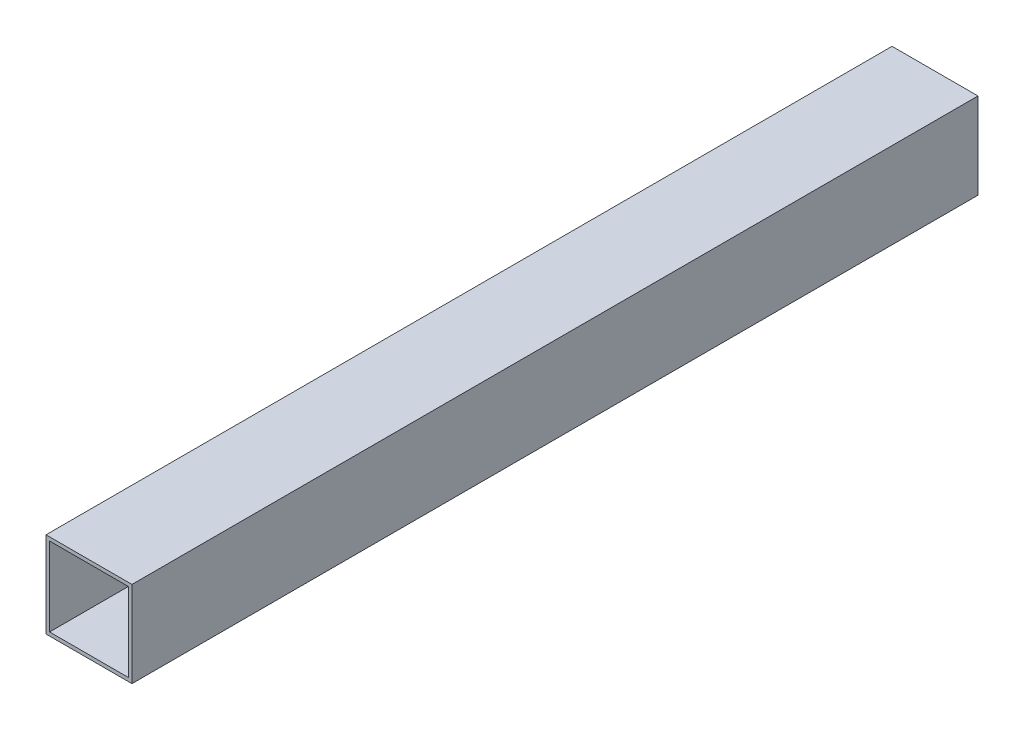
ISO-10303-21;
HEADER;
FILE_DESCRIPTION(('STEP AP214'),'2;1');
FILE_NAME('part.step','',(''),(''),'','','');
FILE_SCHEMA(('AUTOMOTIVE_DESIGN { 1 0 10303 214 1 1 1 1 }'));
ENDSEC;
DATA;
#1=APPLICATION_CONTEXT('core data for automotive mechanical design processes');
#2=APPLICATION_PROTOCOL_DEFINITION('international standard','automotive_design',2000,#1);
#3=PRODUCT_CONTEXT('',#1,'mechanical');
#4=PRODUCT('Part','Part','',(#3));
#5=PRODUCT_RELATED_PRODUCT_CATEGORY('part','',(#4));
#6=PRODUCT_DEFINITION_FORMATION('','',#4);
#7=PRODUCT_DEFINITION_CONTEXT('part definition',#1,'design');
#8=PRODUCT_DEFINITION('design','',#6,#7);
#9=PRODUCT_DEFINITION_SHAPE('','',#8);
#10=(LENGTH_UNIT() NAMED_UNIT(*) SI_UNIT(.MILLI.,.METRE.));
#11=(NAMED_UNIT(*) PLANE_ANGLE_UNIT() SI_UNIT($,.RADIAN.));
#12=(NAMED_UNIT(*) SI_UNIT($,.STERADIAN.) SOLID_ANGLE_UNIT());
#13=UNCERTAINTY_MEASURE_WITH_UNIT(LENGTH_MEASURE(1.E-05),#10,'distance_accuracy_value','');
#14=(GEOMETRIC_REPRESENTATION_CONTEXT(3) GLOBAL_UNCERTAINTY_ASSIGNED_CONTEXT((#13)) GLOBAL_UNIT_ASSIGNED_CONTEXT((#10,
#11,#12)) REPRESENTATION_CONTEXT('',''));
#15=CARTESIAN_POINT('',(0.,0.,0.));
#16=DIRECTION('',(0.,0.,1.));
#17=DIRECTION('',(1.,0.,0.));
#18=AXIS2_PLACEMENT_3D('',#15,#16,#17);
#19=CARTESIAN_POINT('',(-38.1,-38.1,375.));
#20=DIRECTION('',(-1.,0.,0.));
#21=DIRECTION('',(0.,-1.,0.));
#22=AXIS2_PLACEMENT_3D('',#19,#20,#21);
#23=PLANE('',#22);
#24=DIRECTION('',(0.,1.,0.));
#25=VECTOR('',#24,1.);
#26=CARTESIAN_POINT('',(-38.1,-38.1,-375.));
#27=LINE('',#26,#25);
#28=CARTESIAN_POINT('',(-38.1,-38.1,-375.));
#29=VERTEX_POINT('',#28);
#30=CARTESIAN_POINT('',(-38.1,38.1,-375.));
#31=VERTEX_POINT('',#30);
#32=EDGE_CURVE('E136',#29,#31,#27,.T.);
#33=ORIENTED_EDGE('',*,*,#32,.F.);
#34=DIRECTION('',(0.,0.,-1.));
#35=VECTOR('',#34,1.);
#36=CARTESIAN_POINT('',(-38.1,-38.1,375.));
#37=LINE('',#36,#35);
#38=CARTESIAN_POINT('',(-38.1,-38.1,375.));
#39=VERTEX_POINT('',#38);
#40=EDGE_CURVE('E12',#39,#29,#37,.T.);
#41=ORIENTED_EDGE('',*,*,#40,.F.);
#42=DIRECTION('',(0.,1.,0.));
#43=VECTOR('',#42,1.);
#44=CARTESIAN_POINT('',(-38.1,-38.1,375.));
#45=LINE('',#44,#43);
#46=CARTESIAN_POINT('',(-38.1,38.1,375.));
#47=VERTEX_POINT('',#46);
#48=EDGE_CURVE('E163',#39,#47,#45,.T.);
#49=ORIENTED_EDGE('',*,*,#48,.T.);
#50=DIRECTION('',(0.,0.,-1.));
#51=VECTOR('',#50,1.);
#52=CARTESIAN_POINT('',(-38.1,38.1,375.));
#53=LINE('',#52,#51);
#54=EDGE_CURVE('E67',#47,#31,#53,.T.);
#55=ORIENTED_EDGE('',*,*,#54,.T.);
#56=EDGE_LOOP('',(#33,#41,#49,#55));
#57=FACE_BOUND('',#56,.T.);
#58=ADVANCED_FACE('F65',(#57),#23,.T.);
#59=CARTESIAN_POINT('',(-38.1,-38.1,375.));
#60=DIRECTION('',(0.,1.,0.));
#61=DIRECTION('',(-1.,0.,0.));
#62=AXIS2_PLACEMENT_3D('',#59,#60,#61);
#63=PLANE('',#62);
#64=DIRECTION('',(1.,0.,0.));
#65=VECTOR('',#64,1.);
#66=CARTESIAN_POINT('',(-38.1,-38.1,-375.));
#67=LINE('',#66,#65);
#68=CARTESIAN_POINT('',(38.1,-38.1,-375.));
#69=VERTEX_POINT('',#68);
#70=EDGE_CURVE('E170',#29,#69,#67,.T.);
#71=ORIENTED_EDGE('',*,*,#70,.T.);
#72=DIRECTION('',(0.,0.,-1.));
#73=VECTOR('',#72,1.);
#74=CARTESIAN_POINT('',(38.1,-38.1,375.));
#75=LINE('',#74,#73);
#76=CARTESIAN_POINT('',(38.1,-38.1,375.));
#77=VERTEX_POINT('',#76);
#78=EDGE_CURVE('E72',#77,#69,#75,.T.);
#79=ORIENTED_EDGE('',*,*,#78,.F.);
#80=DIRECTION('',(1.,0.,0.));
#81=VECTOR('',#80,1.);
#82=CARTESIAN_POINT('',(-38.1,-38.1,375.));
#83=LINE('',#82,#81);
#84=EDGE_CURVE('E174',#39,#77,#83,.T.);
#85=ORIENTED_EDGE('',*,*,#84,.F.);
#86=ORIENTED_EDGE('',*,*,#40,.T.);
#87=EDGE_LOOP('',(#71,#79,#85,#86));
#88=FACE_BOUND('',#87,.T.);
#89=ADVANCED_FACE('F202',(#88),#63,.F.);
#90=CARTESIAN_POINT('',(38.1,-38.1,375.));
#91=DIRECTION('',(-1.,0.,0.));
#92=DIRECTION('',(0.,0.,1.));
#93=AXIS2_PLACEMENT_3D('',#90,#91,#92);
#94=PLANE('',#93);
#95=DIRECTION('',(0.,1.,0.));
#96=VECTOR('',#95,1.);
#97=CARTESIAN_POINT('',(38.1,-38.1,-375.));
#98=LINE('',#97,#96);
#99=CARTESIAN_POINT('',(38.1,38.1,-375.));
#100=VERTEX_POINT('',#99);
#101=EDGE_CURVE('E181',#69,#100,#98,.T.);
#102=ORIENTED_EDGE('',*,*,#101,.T.);
#103=DIRECTION('',(0.,0.,-1.));
#104=VECTOR('',#103,1.);
#105=CARTESIAN_POINT('',(38.1,38.1,375.));
#106=LINE('',#105,#104);
#107=CARTESIAN_POINT('',(38.1,38.1,375.));
#108=VERTEX_POINT('',#107);
#109=EDGE_CURVE('E186',#108,#100,#106,.T.);
#110=ORIENTED_EDGE('',*,*,#109,.F.);
#111=DIRECTION('',(0.,1.,0.));
#112=VECTOR('',#111,1.);
#113=CARTESIAN_POINT('',(38.1,-38.1,375.));
#114=LINE('',#113,#112);
#115=EDGE_CURVE('E175',#77,#108,#114,.T.);
#116=ORIENTED_EDGE('',*,*,#115,.F.);
#117=ORIENTED_EDGE('',*,*,#78,.T.);
#118=EDGE_LOOP('',(#102,#110,#116,#117));
#119=FACE_BOUND('',#118,.T.);
#120=ADVANCED_FACE('F203',(#119),#94,.F.);
#121=CARTESIAN_POINT('',(-38.1,38.1,375.));
#122=DIRECTION('',(0.,1.,0.));
#123=DIRECTION('',(-1.,0.,0.));
#124=AXIS2_PLACEMENT_3D('',#121,#122,#123);
#125=PLANE('',#124);
#126=DIRECTION('',(1.,0.,0.));
#127=VECTOR('',#126,1.);
#128=CARTESIAN_POINT('',(-38.1,38.1,-375.));
#129=LINE('',#128,#127);
#130=EDGE_CURVE('E178',#31,#100,#129,.T.);
#131=ORIENTED_EDGE('',*,*,#130,.F.);
#132=ORIENTED_EDGE('',*,*,#54,.F.);
#133=DIRECTION('',(1.,0.,0.));
#134=VECTOR('',#133,1.);
#135=CARTESIAN_POINT('',(-38.1,38.1,375.));
#136=LINE('',#135,#134);
#137=EDGE_CURVE('E166',#47,#108,#136,.T.);
#138=ORIENTED_EDGE('',*,*,#137,.T.);
#139=ORIENTED_EDGE('',*,*,#109,.T.);
#140=EDGE_LOOP('',(#131,#132,#138,#139));
#141=FACE_BOUND('',#140,.T.);
#142=ADVANCED_FACE('F191',(#141),#125,.T.);
#143=CARTESIAN_POINT('',(0.,0.,375.));
#144=DIRECTION('',(0.,0.,-1.));
#145=DIRECTION('',(-1.,0.,0.));
#146=AXIS2_PLACEMENT_3D('',#143,#144,#145);
#147=PLANE('',#146);
#148=DIRECTION('',(1.,0.,0.));
#149=VECTOR('',#148,1.);
#150=CARTESIAN_POINT('',(0.,-34.925,375.));
#151=LINE('',#150,#149);
#152=CARTESIAN_POINT('',(-34.925,-34.925,375.));
#153=VERTEX_POINT('',#152);
#154=CARTESIAN_POINT('',(34.925,-34.925,375.));
#155=VERTEX_POINT('',#154);
#156=EDGE_CURVE('E135',#153,#155,#151,.T.);
#157=ORIENTED_EDGE('',*,*,#156,.F.);
#158=DIRECTION('',(0.,1.,0.));
#159=VECTOR('',#158,1.);
#160=CARTESIAN_POINT('',(-34.925,0.,375.));
#161=LINE('',#160,#159);
#162=CARTESIAN_POINT('',(-34.925,34.925,375.));
#163=VERTEX_POINT('',#162);
#164=EDGE_CURVE('E139',#153,#163,#161,.T.);
#165=ORIENTED_EDGE('',*,*,#164,.T.);
#166=DIRECTION('',(1.,0.,0.));
#167=VECTOR('',#166,1.);
#168=CARTESIAN_POINT('',(0.,34.925,375.));
#169=LINE('',#168,#167);
#170=CARTESIAN_POINT('',(34.925,34.925,375.));
#171=VERTEX_POINT('',#170);
#172=EDGE_CURVE('E154',#163,#171,#169,.T.);
#173=ORIENTED_EDGE('',*,*,#172,.T.);
#174=DIRECTION('',(0.,1.,0.));
#175=VECTOR('',#174,1.);
#176=CARTESIAN_POINT('',(34.925,0.,375.));
#177=LINE('',#176,#175);
#178=EDGE_CURVE('E148',#155,#171,#177,.T.);
#179=ORIENTED_EDGE('',*,*,#178,.F.);
#180=EDGE_LOOP('',(#157,#165,#173,#179));
#181=FACE_BOUND('',#180,.T.);
#182=ORIENTED_EDGE('',*,*,#48,.F.);
#183=ORIENTED_EDGE('',*,*,#84,.T.);
#184=ORIENTED_EDGE('',*,*,#115,.T.);
#185=ORIENTED_EDGE('',*,*,#137,.F.);
#186=EDGE_LOOP('',(#182,#183,#184,#185));
#187=FACE_BOUND('',#186,.T.);
#188=ADVANCED_FACE('F149',(#181,#187),#147,.F.);
#189=CARTESIAN_POINT('',(0.,0.,-375.));
#190=DIRECTION('',(0.,0.,-1.));
#191=DIRECTION('',(-1.,0.,0.));
#192=AXIS2_PLACEMENT_3D('',#189,#190,#191);
#193=PLANE('',#192);
#194=DIRECTION('',(0.,1.,0.));
#195=VECTOR('',#194,1.);
#196=CARTESIAN_POINT('',(-34.925,0.,-375.));
#197=LINE('',#196,#195);
#198=CARTESIAN_POINT('',(-34.925,-34.925,-375.));
#199=VERTEX_POINT('',#198);
#200=CARTESIAN_POINT('',(-34.925,34.925,-375.));
#201=VERTEX_POINT('',#200);
#202=EDGE_CURVE('E90',#199,#201,#197,.T.);
#203=ORIENTED_EDGE('',*,*,#202,.F.);
#204=DIRECTION('',(1.,0.,0.));
#205=VECTOR('',#204,1.);
#206=CARTESIAN_POINT('',(0.,-34.925,-375.));
#207=LINE('',#206,#205);
#208=CARTESIAN_POINT('',(34.925,-34.925,-375.));
#209=VERTEX_POINT('',#208);
#210=EDGE_CURVE('E134',#199,#209,#207,.T.);
#211=ORIENTED_EDGE('',*,*,#210,.T.);
#212=DIRECTION('',(0.,1.,0.));
#213=VECTOR('',#212,1.);
#214=CARTESIAN_POINT('',(34.925,0.,-375.));
#215=LINE('',#214,#213);
#216=CARTESIAN_POINT('',(34.925,34.925,-375.));
#217=VERTEX_POINT('',#216);
#218=EDGE_CURVE('E156',#209,#217,#215,.T.);
#219=ORIENTED_EDGE('',*,*,#218,.T.);
#220=DIRECTION('',(1.,0.,0.));
#221=VECTOR('',#220,1.);
#222=CARTESIAN_POINT('',(0.,34.925,-375.));
#223=LINE('',#222,#221);
#224=EDGE_CURVE('E144',#201,#217,#223,.T.);
#225=ORIENTED_EDGE('',*,*,#224,.F.);
#226=EDGE_LOOP('',(#203,#211,#219,#225));
#227=FACE_BOUND('',#226,.T.);
#228=ORIENTED_EDGE('',*,*,#32,.T.);
#229=ORIENTED_EDGE('',*,*,#130,.T.);
#230=ORIENTED_EDGE('',*,*,#101,.F.);
#231=ORIENTED_EDGE('',*,*,#70,.F.);
#232=EDGE_LOOP('',(#228,#229,#230,#231));
#233=FACE_BOUND('',#232,.T.);
#234=ADVANCED_FACE('F200',(#227,#233),#193,.T.);
#235=CARTESIAN_POINT('',(-34.925,0.,375.));
#236=DIRECTION('',(-1.,0.,0.));
#237=DIRECTION('',(0.,0.,1.));
#238=AXIS2_PLACEMENT_3D('',#235,#236,#237);
#239=PLANE('',#238);
#240=ORIENTED_EDGE('',*,*,#202,.T.);
#241=DIRECTION('',(0.,0.,-1.));
#242=VECTOR('',#241,1.);
#243=CARTESIAN_POINT('',(-34.925,34.925,375.));
#244=LINE('',#243,#242);
#245=EDGE_CURVE('E145',#163,#201,#244,.T.);
#246=ORIENTED_EDGE('',*,*,#245,.F.);
#247=ORIENTED_EDGE('',*,*,#164,.F.);
#248=DIRECTION('',(0.,0.,-1.));
#249=VECTOR('',#248,1.);
#250=CARTESIAN_POINT('',(-34.925,-34.925,375.));
#251=LINE('',#250,#249);
#252=EDGE_CURVE('E126',#153,#199,#251,.T.);
#253=ORIENTED_EDGE('',*,*,#252,.T.);
#254=EDGE_LOOP('',(#240,#246,#247,#253));
#255=FACE_BOUND('',#254,.T.);
#256=ADVANCED_FACE('F141',(#255),#239,.F.);
#257=CARTESIAN_POINT('',(0.,-34.925,375.));
#258=DIRECTION('',(0.,1.,0.));
#259=DIRECTION('',(0.,0.,1.));
#260=AXIS2_PLACEMENT_3D('',#257,#258,#259);
#261=PLANE('',#260);
#262=ORIENTED_EDGE('',*,*,#210,.F.);
#263=ORIENTED_EDGE('',*,*,#252,.F.);
#264=ORIENTED_EDGE('',*,*,#156,.T.);
#265=DIRECTION('',(0.,0.,-1.));
#266=VECTOR('',#265,1.);
#267=CARTESIAN_POINT('',(34.925,-34.925,375.));
#268=LINE('',#267,#266);
#269=EDGE_CURVE('E140',#155,#209,#268,.T.);
#270=ORIENTED_EDGE('',*,*,#269,.T.);
#271=EDGE_LOOP('',(#262,#263,#264,#270));
#272=FACE_BOUND('',#271,.T.);
#273=ADVANCED_FACE('F127',(#272),#261,.T.);
#274=CARTESIAN_POINT('',(34.925,0.,375.));
#275=DIRECTION('',(-1.,0.,0.));
#276=DIRECTION('',(0.,0.,1.));
#277=AXIS2_PLACEMENT_3D('',#274,#275,#276);
#278=PLANE('',#277);
#279=ORIENTED_EDGE('',*,*,#218,.F.);
#280=ORIENTED_EDGE('',*,*,#269,.F.);
#281=ORIENTED_EDGE('',*,*,#178,.T.);
#282=DIRECTION('',(0.,0.,-1.));
#283=VECTOR('',#282,1.);
#284=CARTESIAN_POINT('',(34.925,34.925,375.));
#285=LINE('',#284,#283);
#286=EDGE_CURVE('E80',#171,#217,#285,.T.);
#287=ORIENTED_EDGE('',*,*,#286,.T.);
#288=EDGE_LOOP('',(#279,#280,#281,#287));
#289=FACE_BOUND('',#288,.T.);
#290=ADVANCED_FACE('F256',(#289),#278,.T.);
#291=CARTESIAN_POINT('',(0.,34.925,375.));
#292=DIRECTION('',(0.,1.,0.));
#293=DIRECTION('',(-1.,0.,0.));
#294=AXIS2_PLACEMENT_3D('',#291,#292,#293);
#295=PLANE('',#294);
#296=ORIENTED_EDGE('',*,*,#224,.T.);
#297=ORIENTED_EDGE('',*,*,#286,.F.);
#298=ORIENTED_EDGE('',*,*,#172,.F.);
#299=ORIENTED_EDGE('',*,*,#245,.T.);
#300=EDGE_LOOP('',(#296,#297,#298,#299));
#301=FACE_BOUND('',#300,.T.);
#302=ADVANCED_FACE('F270',(#301),#295,.F.);
#303=CLOSED_SHELL('',(#58,#89,#120,#142,#188,#234,#256,#273,#290,#302));
#304=MANIFOLD_SOLID_BREP('B2',#303);
#305=ADVANCED_BREP_SHAPE_REPRESENTATION('',(#18,#304),#14);
#306=SHAPE_DEFINITION_REPRESENTATION(#9,#305);
ENDSEC;
END-ISO-10303-21;
